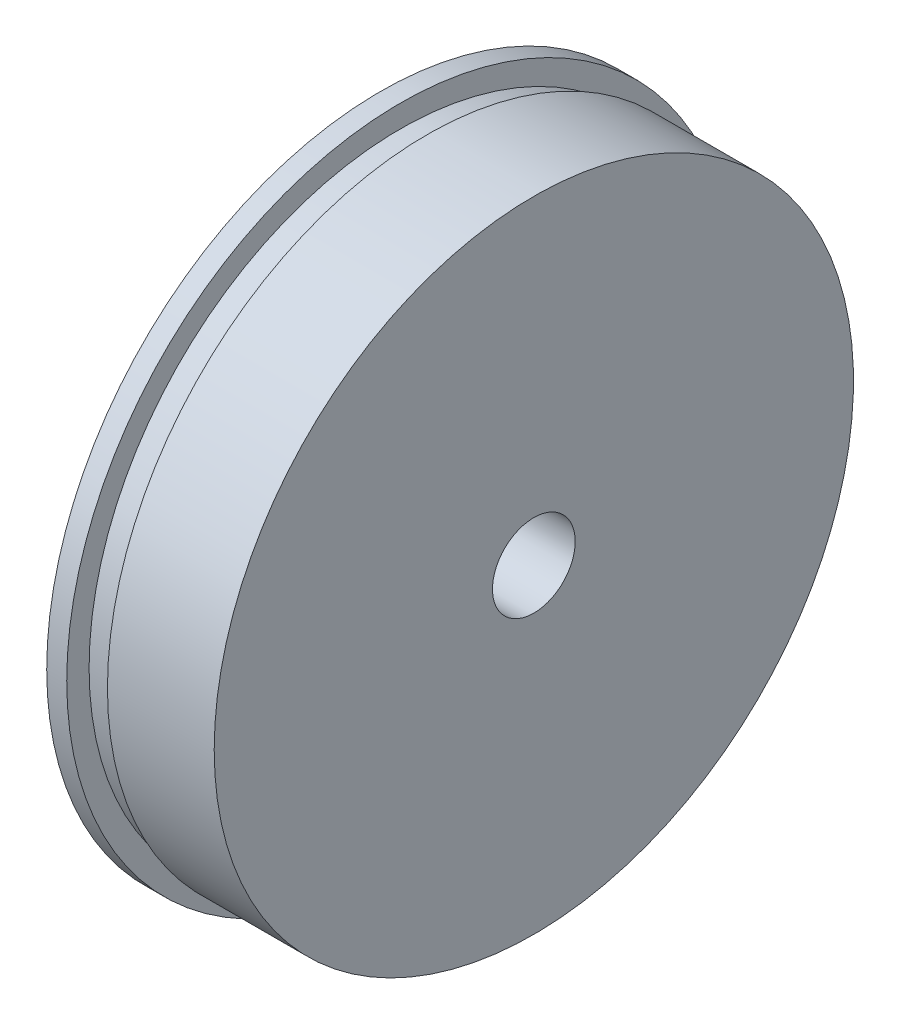
ISO-10303-21;
HEADER;
FILE_DESCRIPTION(('STEP AP214'),'2;1');
FILE_NAME('part.step','',(''),(''),'','','');
FILE_SCHEMA(('AUTOMOTIVE_DESIGN { 1 0 10303 214 1 1 1 1 }'));
ENDSEC;
DATA;
#1=APPLICATION_CONTEXT('core data for automotive mechanical design processes');
#2=APPLICATION_PROTOCOL_DEFINITION('international standard','automotive_design',2000,#1);
#3=PRODUCT_CONTEXT('',#1,'mechanical');
#4=PRODUCT('Part','Part','',(#3));
#5=PRODUCT_RELATED_PRODUCT_CATEGORY('part','',(#4));
#6=PRODUCT_DEFINITION_FORMATION('','',#4);
#7=PRODUCT_DEFINITION_CONTEXT('part definition',#1,'design');
#8=PRODUCT_DEFINITION('design','',#6,#7);
#9=PRODUCT_DEFINITION_SHAPE('','',#8);
#10=(LENGTH_UNIT() NAMED_UNIT(*) SI_UNIT(.MILLI.,.METRE.));
#11=(NAMED_UNIT(*) PLANE_ANGLE_UNIT() SI_UNIT($,.RADIAN.));
#12=(NAMED_UNIT(*) SI_UNIT($,.STERADIAN.) SOLID_ANGLE_UNIT());
#13=UNCERTAINTY_MEASURE_WITH_UNIT(LENGTH_MEASURE(1.E-05),#10,'distance_accuracy_value','');
#14=(GEOMETRIC_REPRESENTATION_CONTEXT(3) GLOBAL_UNCERTAINTY_ASSIGNED_CONTEXT((#13)) GLOBAL_UNIT_ASSIGNED_CONTEXT((#10,
#11,#12)) REPRESENTATION_CONTEXT('',''));
#15=CARTESIAN_POINT('',(0.,0.,0.));
#16=DIRECTION('',(0.,0.,1.));
#17=DIRECTION('',(1.,0.,0.));
#18=AXIS2_PLACEMENT_3D('',#15,#16,#17);
#19=CARTESIAN_POINT('',(0.,0.,0.));
#20=DIRECTION('',(-1.,0.,0.));
#21=DIRECTION('',(0.,0.,1.));
#22=AXIS2_PLACEMENT_3D('',#19,#20,#21);
#23=PLANE('',#22);
#24=CARTESIAN_POINT('',(0.,0.,0.));
#25=DIRECTION('',(1.,0.,0.));
#26=DIRECTION('',(0.,0.,-1.));
#27=AXIS2_PLACEMENT_3D('',#24,#25,#26);
#28=CIRCLE('',#27,1.5748);
#29=CARTESIAN_POINT('',(0.,0.,-1.5748));
#30=VERTEX_POINT('',#29);
#31=EDGE_CURVE('E55',#30,#30,#28,.T.);
#32=ORIENTED_EDGE('',*,*,#31,.T.);
#33=EDGE_LOOP('',(#32));
#34=FACE_BOUND('',#33,.T.);
#35=CARTESIAN_POINT('',(0.,0.,0.));
#36=DIRECTION('',(-1.,0.,0.));
#37=DIRECTION('',(0.,0.,1.));
#38=AXIS2_PLACEMENT_3D('',#35,#36,#37);
#39=CIRCLE('',#38,12.7);
#40=CARTESIAN_POINT('',(0.,0.,12.7));
#41=VERTEX_POINT('',#40);
#42=EDGE_CURVE('E10',#41,#41,#39,.T.);
#43=ORIENTED_EDGE('',*,*,#42,.T.);
#44=EDGE_LOOP('',(#43));
#45=FACE_BOUND('',#44,.T.);
#46=ADVANCED_FACE('F30',(#34,#45),#23,.T.);
#47=CARTESIAN_POINT('',(0.,0.,0.));
#48=DIRECTION('',(-1.,0.,0.));
#49=DIRECTION('',(0.,0.,1.));
#50=AXIS2_PLACEMENT_3D('',#47,#48,#49);
#51=CYLINDRICAL_SURFACE('',#50,12.7);
#52=CARTESIAN_POINT('',(0.762000000000001,0.,0.));
#53=DIRECTION('',(-1.,0.,0.));
#54=DIRECTION('',(0.,0.,1.));
#55=AXIS2_PLACEMENT_3D('',#52,#53,#54);
#56=CIRCLE('',#55,12.7);
#57=CARTESIAN_POINT('',(0.762000000000001,0.,12.7));
#58=VERTEX_POINT('',#57);
#59=EDGE_CURVE('E36',#58,#58,#56,.T.);
#60=ORIENTED_EDGE('',*,*,#59,.T.);
#61=EDGE_LOOP('',(#60));
#62=FACE_BOUND('',#61,.T.);
#63=ORIENTED_EDGE('',*,*,#42,.F.);
#64=EDGE_LOOP('',(#63));
#65=FACE_BOUND('',#64,.T.);
#66=ADVANCED_FACE('F96',(#62,#65),#51,.T.);
#67=CARTESIAN_POINT('',(0.762000000000001,-12.7,0.));
#68=DIRECTION('',(1.,0.,0.));
#69=DIRECTION('',(0.,0.,-1.));
#70=AXIS2_PLACEMENT_3D('',#67,#68,#69);
#71=PLANE('',#70);
#72=CARTESIAN_POINT('',(0.762000000000001,0.,0.));
#73=DIRECTION('',(-1.,0.,0.));
#74=DIRECTION('',(0.,0.,1.));
#75=AXIS2_PLACEMENT_3D('',#72,#73,#74);
#76=CIRCLE('',#75,11.8491);
#77=CARTESIAN_POINT('',(0.762000000000001,0.,11.8491));
#78=VERTEX_POINT('',#77);
#79=EDGE_CURVE('E40',#78,#78,#76,.T.);
#80=ORIENTED_EDGE('',*,*,#79,.T.);
#81=EDGE_LOOP('',(#80));
#82=FACE_BOUND('',#81,.T.);
#83=ORIENTED_EDGE('',*,*,#59,.F.);
#84=EDGE_LOOP('',(#83));
#85=FACE_BOUND('',#84,.T.);
#86=ADVANCED_FACE('F90',(#82,#85),#71,.T.);
#87=CARTESIAN_POINT('',(0.,0.,0.));
#88=DIRECTION('',(-1.,0.,0.));
#89=DIRECTION('',(0.,0.,1.));
#90=AXIS2_PLACEMENT_3D('',#87,#88,#89);
#91=CYLINDRICAL_SURFACE('',#90,11.8491);
#92=CARTESIAN_POINT('',(1.778,0.,0.));
#93=DIRECTION('',(-1.,0.,0.));
#94=DIRECTION('',(0.,0.,1.));
#95=AXIS2_PLACEMENT_3D('',#92,#93,#94);
#96=CIRCLE('',#95,11.8491);
#97=CARTESIAN_POINT('',(1.778,0.,11.8491));
#98=VERTEX_POINT('',#97);
#99=EDGE_CURVE('E44',#98,#98,#96,.T.);
#100=ORIENTED_EDGE('',*,*,#99,.T.);
#101=EDGE_LOOP('',(#100));
#102=FACE_BOUND('',#101,.T.);
#103=ORIENTED_EDGE('',*,*,#79,.F.);
#104=EDGE_LOOP('',(#103));
#105=FACE_BOUND('',#104,.T.);
#106=ADVANCED_FACE('F84',(#102,#105),#91,.T.);
#107=CARTESIAN_POINT('',(1.778,-11.8491,0.));
#108=DIRECTION('',(-1.,0.,0.));
#109=DIRECTION('',(0.,0.,1.));
#110=AXIS2_PLACEMENT_3D('',#107,#108,#109);
#111=PLANE('',#110);
#112=CARTESIAN_POINT('',(1.778,0.,0.));
#113=DIRECTION('',(-1.,0.,0.));
#114=DIRECTION('',(0.,0.,1.));
#115=AXIS2_PLACEMENT_3D('',#112,#113,#114);
#116=CIRCLE('',#115,12.1666);
#117=CARTESIAN_POINT('',(1.778,0.,12.1666));
#118=VERTEX_POINT('',#117);
#119=EDGE_CURVE('E49',#118,#118,#116,.T.);
#120=ORIENTED_EDGE('',*,*,#119,.T.);
#121=EDGE_LOOP('',(#120));
#122=FACE_BOUND('',#121,.T.);
#123=ORIENTED_EDGE('',*,*,#99,.F.);
#124=EDGE_LOOP('',(#123));
#125=FACE_BOUND('',#124,.T.);
#126=ADVANCED_FACE('F78',(#122,#125),#111,.T.);
#127=CARTESIAN_POINT('',(0.,0.,0.));
#128=DIRECTION('',(-1.,0.,0.));
#129=DIRECTION('',(0.,0.,1.));
#130=AXIS2_PLACEMENT_3D('',#127,#128,#129);
#131=CYLINDRICAL_SURFACE('',#130,12.1666);
#132=CARTESIAN_POINT('',(5.842,0.,0.));
#133=DIRECTION('',(-1.,0.,0.));
#134=DIRECTION('',(0.,0.,1.));
#135=AXIS2_PLACEMENT_3D('',#132,#133,#134);
#136=CIRCLE('',#135,12.1666);
#137=CARTESIAN_POINT('',(5.842,0.,12.1666));
#138=VERTEX_POINT('',#137);
#139=EDGE_CURVE('E52',#138,#138,#136,.T.);
#140=ORIENTED_EDGE('',*,*,#139,.T.);
#141=EDGE_LOOP('',(#140));
#142=FACE_BOUND('',#141,.T.);
#143=ORIENTED_EDGE('',*,*,#119,.F.);
#144=EDGE_LOOP('',(#143));
#145=FACE_BOUND('',#144,.T.);
#146=ADVANCED_FACE('F72',(#142,#145),#131,.T.);
#147=CARTESIAN_POINT('',(5.842,-12.1666,0.));
#148=DIRECTION('',(1.,0.,0.));
#149=DIRECTION('',(0.,0.,-1.));
#150=AXIS2_PLACEMENT_3D('',#147,#148,#149);
#151=PLANE('',#150);
#152=CARTESIAN_POINT('',(5.842,0.,0.));
#153=DIRECTION('',(1.,0.,0.));
#154=DIRECTION('',(0.,0.,-1.));
#155=AXIS2_PLACEMENT_3D('',#152,#153,#154);
#156=CIRCLE('',#155,1.5748);
#157=CARTESIAN_POINT('',(5.842,0.,-1.5748));
#158=VERTEX_POINT('',#157);
#159=EDGE_CURVE('E56',#158,#158,#156,.T.);
#160=ORIENTED_EDGE('',*,*,#159,.F.);
#161=EDGE_LOOP('',(#160));
#162=FACE_BOUND('',#161,.T.);
#163=ORIENTED_EDGE('',*,*,#139,.F.);
#164=EDGE_LOOP('',(#163));
#165=FACE_BOUND('',#164,.T.);
#166=ADVANCED_FACE('F66',(#162,#165),#151,.T.);
#167=CARTESIAN_POINT('',(0.,0.,0.));
#168=DIRECTION('',(1.,0.,0.));
#169=DIRECTION('',(0.,0.,-1.));
#170=AXIS2_PLACEMENT_3D('',#167,#168,#169);
#171=CYLINDRICAL_SURFACE('',#170,1.5748);
#172=ORIENTED_EDGE('',*,*,#31,.F.);
#173=EDGE_LOOP('',(#172));
#174=FACE_BOUND('',#173,.T.);
#175=ORIENTED_EDGE('',*,*,#159,.T.);
#176=EDGE_LOOP('',(#175));
#177=FACE_BOUND('',#176,.T.);
#178=ADVANCED_FACE('F63',(#174,#177),#171,.F.);
#179=CLOSED_SHELL('',(#46,#66,#86,#106,#126,#146,#166,#178));
#180=MANIFOLD_SOLID_BREP('B2',#179);
#181=ADVANCED_BREP_SHAPE_REPRESENTATION('',(#18,#180),#14);
#182=SHAPE_DEFINITION_REPRESENTATION(#9,#181);
ENDSEC;
END-ISO-10303-21;
